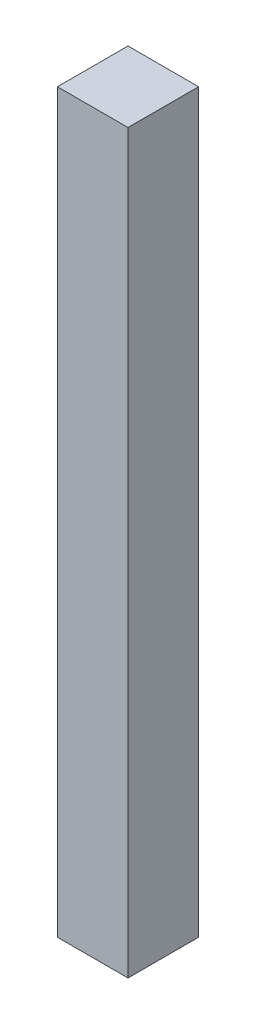
ISO-10303-21;
HEADER;
FILE_DESCRIPTION(('STEP AP214'),'2;1');
FILE_NAME('part.step','',(''),(''),'','','');
FILE_SCHEMA(('AUTOMOTIVE_DESIGN { 1 0 10303 214 1 1 1 1 }'));
ENDSEC;
DATA;
#1=APPLICATION_CONTEXT('core data for automotive mechanical design processes');
#2=APPLICATION_PROTOCOL_DEFINITION('international standard','automotive_design',2000,#1);
#3=PRODUCT_CONTEXT('',#1,'mechanical');
#4=PRODUCT('Part','Part','',(#3));
#5=PRODUCT_RELATED_PRODUCT_CATEGORY('part','',(#4));
#6=PRODUCT_DEFINITION_FORMATION('','',#4);
#7=PRODUCT_DEFINITION_CONTEXT('part definition',#1,'design');
#8=PRODUCT_DEFINITION('design','',#6,#7);
#9=PRODUCT_DEFINITION_SHAPE('','',#8);
#10=(LENGTH_UNIT() NAMED_UNIT(*) SI_UNIT(.MILLI.,.METRE.));
#11=(NAMED_UNIT(*) PLANE_ANGLE_UNIT() SI_UNIT($,.RADIAN.));
#12=(NAMED_UNIT(*) SI_UNIT($,.STERADIAN.) SOLID_ANGLE_UNIT());
#13=UNCERTAINTY_MEASURE_WITH_UNIT(LENGTH_MEASURE(1.E-05),#10,'distance_accuracy_value','');
#14=(GEOMETRIC_REPRESENTATION_CONTEXT(3) GLOBAL_UNCERTAINTY_ASSIGNED_CONTEXT((#13)) GLOBAL_UNIT_ASSIGNED_CONTEXT((#10,
#11,#12)) REPRESENTATION_CONTEXT('',''));
#15=CARTESIAN_POINT('',(0.,0.,0.));
#16=DIRECTION('',(0.,0.,1.));
#17=DIRECTION('',(1.,0.,0.));
#18=AXIS2_PLACEMENT_3D('',#15,#16,#17);
#19=CARTESIAN_POINT('',(0.,-45.0088951198897,0.));
#20=DIRECTION('',(0.,1.,0.));
#21=DIRECTION('',(0.,0.,1.));
#22=AXIS2_PLACEMENT_3D('',#19,#20,#21);
#23=PLANE('',#22);
#24=DIRECTION('',(0.,0.,1.));
#25=VECTOR('',#24,1.);
#26=CARTESIAN_POINT('',(-76.5788995902752,-45.0088951198897,50.3534205439696));
#27=LINE('',#26,#25);
#28=CARTESIAN_POINT('',(-76.5788995902752,-45.0088951198897,41.0824205439696));
#29=VERTEX_POINT('',#28);
#30=CARTESIAN_POINT('',(-76.5788995902752,-45.0088951198897,50.3534205439696));
#31=VERTEX_POINT('',#30);
#32=EDGE_CURVE('E83',#29,#31,#27,.T.);
#33=ORIENTED_EDGE('',*,*,#32,.F.);
#34=DIRECTION('',(-1.,0.,0.));
#35=VECTOR('',#34,1.);
#36=CARTESIAN_POINT('',(-67.3078995902752,-45.0088951198897,41.0824205439696));
#37=LINE('',#36,#35);
#38=CARTESIAN_POINT('',(-67.3078995902752,-45.0088951198897,41.0824205439696));
#39=VERTEX_POINT('',#38);
#40=EDGE_CURVE('E94',#39,#29,#37,.T.);
#41=ORIENTED_EDGE('',*,*,#40,.F.);
#42=DIRECTION('',(0.,0.,-1.));
#43=VECTOR('',#42,1.);
#44=CARTESIAN_POINT('',(-67.3078995902752,-45.0088951198897,50.3534205439696));
#45=LINE('',#44,#43);
#46=CARTESIAN_POINT('',(-67.3078995902752,-45.0088951198897,50.3534205439696));
#47=VERTEX_POINT('',#46);
#48=EDGE_CURVE('E85',#47,#39,#45,.T.);
#49=ORIENTED_EDGE('',*,*,#48,.F.);
#50=DIRECTION('',(1.,0.,0.));
#51=VECTOR('',#50,1.);
#52=CARTESIAN_POINT('',(-67.3078995902752,-45.0088951198897,50.3534205439696));
#53=LINE('',#52,#51);
#54=EDGE_CURVE('E75',#31,#47,#53,.T.);
#55=ORIENTED_EDGE('',*,*,#54,.F.);
#56=EDGE_LOOP('',(#33,#41,#49,#55));
#57=FACE_BOUND('',#56,.T.);
#58=ADVANCED_FACE('F33',(#57),#23,.F.);
#59=CARTESIAN_POINT('',(-67.3078995902752,64.833945483538,41.0824205439696));
#60=DIRECTION('',(0.,0.,1.));
#61=DIRECTION('',(1.,0.,0.));
#62=AXIS2_PLACEMENT_3D('',#59,#60,#61);
#63=PLANE('',#62);
#64=DIRECTION('',(0.,-1.,0.));
#65=VECTOR('',#64,1.);
#66=CARTESIAN_POINT('',(-76.5788995902752,64.833945483538,41.0824205439696));
#67=LINE('',#66,#65);
#68=CARTESIAN_POINT('',(-76.5788995902752,51.722771546777,41.0824205439696));
#69=VERTEX_POINT('',#68);
#70=EDGE_CURVE('E88',#69,#29,#67,.T.);
#71=ORIENTED_EDGE('',*,*,#70,.F.);
#72=DIRECTION('',(1.,0.,0.));
#73=VECTOR('',#72,1.);
#74=CARTESIAN_POINT('',(-67.3078995902752,51.722771546777,41.0824205439696));
#75=LINE('',#74,#73);
#76=CARTESIAN_POINT('',(-67.3078995902752,51.722771546777,41.0824205439696));
#77=VERTEX_POINT('',#76);
#78=EDGE_CURVE('E37',#69,#77,#75,.T.);
#79=ORIENTED_EDGE('',*,*,#78,.T.);
#80=DIRECTION('',(0.,-1.,0.));
#81=VECTOR('',#80,1.);
#82=CARTESIAN_POINT('',(-67.3078995902752,64.833945483538,41.0824205439696));
#83=LINE('',#82,#81);
#84=EDGE_CURVE('E97',#77,#39,#83,.T.);
#85=ORIENTED_EDGE('',*,*,#84,.T.);
#86=ORIENTED_EDGE('',*,*,#40,.T.);
#87=EDGE_LOOP('',(#71,#79,#85,#86));
#88=FACE_BOUND('',#87,.T.);
#89=ADVANCED_FACE('F106',(#88),#63,.F.);
#90=CARTESIAN_POINT('',(-67.3078995902752,64.833945483538,50.3534205439696));
#91=DIRECTION('',(-1.,0.,0.));
#92=DIRECTION('',(0.,0.,1.));
#93=AXIS2_PLACEMENT_3D('',#90,#91,#92);
#94=PLANE('',#93);
#95=ORIENTED_EDGE('',*,*,#84,.F.);
#96=DIRECTION('',(0.,0.,1.));
#97=VECTOR('',#96,1.);
#98=CARTESIAN_POINT('',(-67.3078995902752,51.722771546777,50.3534205439696));
#99=LINE('',#98,#97);
#100=CARTESIAN_POINT('',(-67.3078995902752,51.722771546777,50.3534205439696));
#101=VERTEX_POINT('',#100);
#102=EDGE_CURVE('E103',#77,#101,#99,.T.);
#103=ORIENTED_EDGE('',*,*,#102,.T.);
#104=DIRECTION('',(0.,-1.,0.));
#105=VECTOR('',#104,1.);
#106=CARTESIAN_POINT('',(-67.3078995902752,64.833945483538,50.3534205439696));
#107=LINE('',#106,#105);
#108=EDGE_CURVE('E79',#101,#47,#107,.T.);
#109=ORIENTED_EDGE('',*,*,#108,.T.);
#110=ORIENTED_EDGE('',*,*,#48,.T.);
#111=EDGE_LOOP('',(#95,#103,#109,#110));
#112=FACE_BOUND('',#111,.T.);
#113=ADVANCED_FACE('F102',(#112),#94,.F.);
#114=CARTESIAN_POINT('',(-67.3078995902752,64.833945483538,50.3534205439696));
#115=DIRECTION('',(0.,0.,-1.));
#116=DIRECTION('',(-1.,0.,0.));
#117=AXIS2_PLACEMENT_3D('',#114,#115,#116);
#118=PLANE('',#117);
#119=ORIENTED_EDGE('',*,*,#108,.F.);
#120=DIRECTION('',(-1.,0.,0.));
#121=VECTOR('',#120,1.);
#122=CARTESIAN_POINT('',(-67.3078995902752,51.722771546777,50.3534205439696));
#123=LINE('',#122,#121);
#124=CARTESIAN_POINT('',(-76.5788995902752,51.722771546777,50.3534205439696));
#125=VERTEX_POINT('',#124);
#126=EDGE_CURVE('E42',#101,#125,#123,.T.);
#127=ORIENTED_EDGE('',*,*,#126,.T.);
#128=DIRECTION('',(0.,-1.,0.));
#129=VECTOR('',#128,1.);
#130=CARTESIAN_POINT('',(-76.5788995902752,64.833945483538,50.3534205439696));
#131=LINE('',#130,#129);
#132=EDGE_CURVE('E72',#125,#31,#131,.T.);
#133=ORIENTED_EDGE('',*,*,#132,.T.);
#134=ORIENTED_EDGE('',*,*,#54,.T.);
#135=EDGE_LOOP('',(#119,#127,#133,#134));
#136=FACE_BOUND('',#135,.T.);
#137=ADVANCED_FACE('F74',(#136),#118,.F.);
#138=CARTESIAN_POINT('',(-76.5788995902752,64.833945483538,50.3534205439696));
#139=DIRECTION('',(1.,0.,0.));
#140=DIRECTION('',(0.,0.,-1.));
#141=AXIS2_PLACEMENT_3D('',#138,#139,#140);
#142=PLANE('',#141);
#143=ORIENTED_EDGE('',*,*,#132,.F.);
#144=DIRECTION('',(0.,0.,-1.));
#145=VECTOR('',#144,1.);
#146=CARTESIAN_POINT('',(-76.5788995902752,51.722771546777,50.3534205439696));
#147=LINE('',#146,#145);
#148=EDGE_CURVE('E11',#125,#69,#147,.T.);
#149=ORIENTED_EDGE('',*,*,#148,.T.);
#150=ORIENTED_EDGE('',*,*,#70,.T.);
#151=ORIENTED_EDGE('',*,*,#32,.T.);
#152=EDGE_LOOP('',(#143,#149,#150,#151));
#153=FACE_BOUND('',#152,.T.);
#154=ADVANCED_FACE('F35',(#153),#142,.F.);
#155=CARTESIAN_POINT('',(-80.6591041345707,51.722771546777,62.3549205439696));
#156=DIRECTION('',(0.,-1.,0.));
#157=DIRECTION('',(0.,0.,-1.));
#158=AXIS2_PLACEMENT_3D('',#155,#156,#157);
#159=PLANE('',#158);
#160=ORIENTED_EDGE('',*,*,#126,.F.);
#161=ORIENTED_EDGE('',*,*,#102,.F.);
#162=ORIENTED_EDGE('',*,*,#78,.F.);
#163=ORIENTED_EDGE('',*,*,#148,.F.);
#164=EDGE_LOOP('',(#160,#161,#162,#163));
#165=FACE_BOUND('',#164,.T.);
#166=ADVANCED_FACE('F120',(#165),#159,.F.);
#167=CLOSED_SHELL('',(#58,#89,#113,#137,#154,#166));
#168=MANIFOLD_SOLID_BREP('B2',#167);
#169=ADVANCED_BREP_SHAPE_REPRESENTATION('',(#18,#168),#14);
#170=SHAPE_DEFINITION_REPRESENTATION(#9,#169);
ENDSEC;
END-ISO-10303-21;
